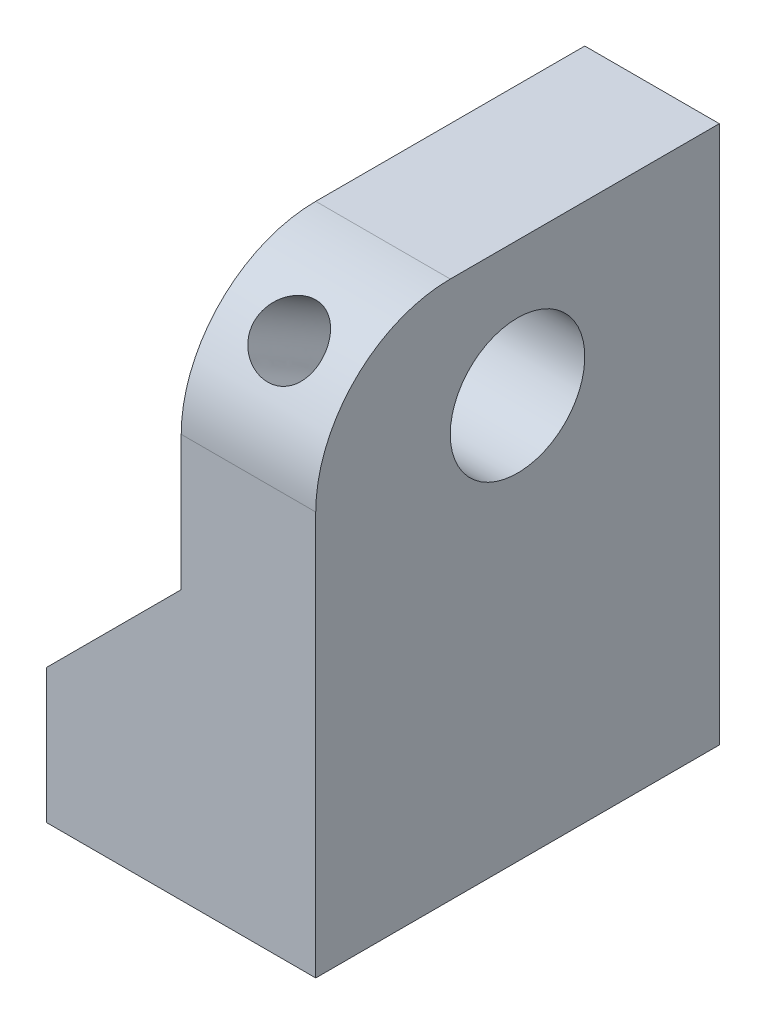
ISO-10303-21;
HEADER;
FILE_DESCRIPTION(('STEP AP214'),'2;1');
FILE_NAME('part.step','',(''),(''),'','','');
FILE_SCHEMA(('AUTOMOTIVE_DESIGN { 1 0 10303 214 1 1 1 1 }'));
ENDSEC;
DATA;
#1=APPLICATION_CONTEXT('core data for automotive mechanical design processes');
#2=APPLICATION_PROTOCOL_DEFINITION('international standard','automotive_design',2000,#1);
#3=PRODUCT_CONTEXT('',#1,'mechanical');
#4=PRODUCT('Part','Part','',(#3));
#5=PRODUCT_RELATED_PRODUCT_CATEGORY('part','',(#4));
#6=PRODUCT_DEFINITION_FORMATION('','',#4);
#7=PRODUCT_DEFINITION_CONTEXT('part definition',#1,'design');
#8=PRODUCT_DEFINITION('design','',#6,#7);
#9=PRODUCT_DEFINITION_SHAPE('','',#8);
#10=(LENGTH_UNIT() NAMED_UNIT(*) SI_UNIT(.MILLI.,.METRE.));
#11=(NAMED_UNIT(*) PLANE_ANGLE_UNIT() SI_UNIT($,.RADIAN.));
#12=(NAMED_UNIT(*) SI_UNIT($,.STERADIAN.) SOLID_ANGLE_UNIT());
#13=UNCERTAINTY_MEASURE_WITH_UNIT(LENGTH_MEASURE(1.E-05),#10,'distance_accuracy_value','');
#14=(GEOMETRIC_REPRESENTATION_CONTEXT(3) GLOBAL_UNCERTAINTY_ASSIGNED_CONTEXT((#13)) GLOBAL_UNIT_ASSIGNED_CONTEXT((#10,
#11,#12)) REPRESENTATION_CONTEXT('',''));
#15=CARTESIAN_POINT('',(0.,0.,0.));
#16=DIRECTION('',(0.,0.,1.));
#17=DIRECTION('',(1.,0.,0.));
#18=AXIS2_PLACEMENT_3D('',#15,#16,#17);
#19=CARTESIAN_POINT('',(0.,76.2,50.8));
#20=DIRECTION('',(1.,0.,0.));
#21=DIRECTION('',(0.,0.,-1.));
#22=AXIS2_PLACEMENT_3D('',#19,#20,#21);
#23=CYLINDRICAL_SURFACE('',#22,25.4);
#24=CARTESIAN_POINT('',(50.8,76.2,50.8));
#25=DIRECTION('',(-1.,0.,0.));
#26=DIRECTION('',(0.,0.,1.));
#27=AXIS2_PLACEMENT_3D('',#24,#25,#26);
#28=CIRCLE('',#27,25.4);
#29=CARTESIAN_POINT('',(50.8,101.6,50.8));
#30=VERTEX_POINT('',#29);
#31=CARTESIAN_POINT('',(50.8,76.2,76.2));
#32=VERTEX_POINT('',#31);
#33=EDGE_CURVE('E11',#30,#32,#28,.F.);
#34=ORIENTED_EDGE('',*,*,#33,.F.);
#35=DIRECTION('',(-1.,0.,0.));
#36=VECTOR('',#35,1.);
#37=CARTESIAN_POINT('',(50.8,101.6,50.8));
#38=LINE('',#37,#36);
#39=CARTESIAN_POINT('',(25.4,101.6,50.8));
#40=VERTEX_POINT('',#39);
#41=EDGE_CURVE('E52',#40,#30,#38,.F.);
#42=ORIENTED_EDGE('',*,*,#41,.F.);
#43=CARTESIAN_POINT('',(25.4,76.2,50.8));
#44=DIRECTION('',(1.,0.,0.));
#45=DIRECTION('',(0.,1.,0.));
#46=AXIS2_PLACEMENT_3D('',#43,#44,#45);
#47=CIRCLE('',#46,25.4);
#48=CARTESIAN_POINT('',(25.4,76.2,76.2));
#49=VERTEX_POINT('',#48);
#50=EDGE_CURVE('E67',#49,#40,#47,.F.);
#51=ORIENTED_EDGE('',*,*,#50,.F.);
#52=DIRECTION('',(-1.,0.,0.));
#53=VECTOR('',#52,1.);
#54=CARTESIAN_POINT('',(25.4,76.2,76.2));
#55=LINE('',#54,#53);
#56=EDGE_CURVE('E128',#32,#49,#55,.T.);
#57=ORIENTED_EDGE('',*,*,#56,.F.);
#58=EDGE_LOOP('',(#34,#42,#51,#57));
#59=FACE_BOUND('',#58,.T.);
#60=CARTESIAN_POINT('',(38.1,89.275241336489,72.5760892722401));
#61=CARTESIAN_POINT('',(37.9170328962884,89.2752373420838,72.576089398587));
#62=CARTESIAN_POINT('',(37.7341180644595,89.2818028812081,72.5721528815052));
#63=CARTESIAN_POINT('',(37.3695154465627,89.3079997814108,72.5563921952738));
#64=CARTESIAN_POINT('',(37.1878278252673,89.3276328631241,72.5445669874007));
#65=CARTESIAN_POINT('',(36.8269479681974,89.379808979736,72.5129813060565));
#66=CARTESIAN_POINT('',(36.647756723884,89.4123570006839,72.4932177678111));
#67=CARTESIAN_POINT('',(36.2931450450948,89.4900878066098,72.4456841476632));
#68=CARTESIAN_POINT('',(36.117725987809,89.535275124486,72.4179111931901));
#69=CARTESIAN_POINT('',(35.7719648604664,89.6378869233838,72.3542765433301));
#70=CARTESIAN_POINT('',(35.6016238698121,89.6953139852611,72.3184131419091));
#71=CARTESIAN_POINT('',(35.2672463507092,89.8219082300627,72.2384985176156));
#72=CARTESIAN_POINT('',(35.1032127801747,89.8910808407511,72.1944435084005));
#73=CARTESIAN_POINT('',(34.782815108772,90.0404970529847,72.09808767309));
#74=CARTESIAN_POINT('',(34.6264498677734,90.1207390019305,72.0457880777061));
#75=CARTESIAN_POINT('',(34.3226765242754,90.2915013443349,71.9329140118233));
#76=CARTESIAN_POINT('',(34.1752639338568,90.3820165214866,71.8723437376773));
#77=CARTESIAN_POINT('',(33.893208161926,90.5706815113395,71.7441225579569));
#78=CARTESIAN_POINT('',(33.7583764517028,90.6686549357898,71.6766269098176));
#79=CARTESIAN_POINT('',(33.4995646782023,90.8727048917007,71.5337221323937));
#80=CARTESIAN_POINT('',(33.3755801871744,90.9787780834729,71.4583162599029));
#81=CARTESIAN_POINT('',(33.13944193449,91.1980191010517,71.2997005707466));
#82=CARTESIAN_POINT('',(33.0272878181255,91.3111867139852,71.2164909881998));
#83=CARTESIAN_POINT('',(32.8157611854779,91.5434845043886,71.0424932709063));
#84=CARTESIAN_POINT('',(32.7163882011309,91.6626144632865,70.9517054138883));
#85=CARTESIAN_POINT('',(32.5350900923264,91.9006039397561,70.7667923055924));
#86=CARTESIAN_POINT('',(32.4526138253318,92.0192713807174,70.672959797923));
#87=CARTESIAN_POINT('',(32.3008055840992,92.2598598709922,70.4790438256468));
#88=CARTESIAN_POINT('',(32.2314732128993,92.3817808219187,70.3789605499424));
#89=CARTESIAN_POINT('',(32.1064544329348,92.6277203646467,70.1730667704056));
#90=CARTESIAN_POINT('',(32.0507655693029,92.7517385747903,70.0672573010727));
#91=CARTESIAN_POINT('',(31.95336115107,93.0007652716906,69.8504995118036));
#92=CARTESIAN_POINT('',(31.9116454631014,93.1257737489839,69.7395512409265));
#93=CARTESIAN_POINT('',(31.8432750069799,93.3724406719273,69.516149420471));
#94=CARTESIAN_POINT('',(31.816257546296,93.4941018812851,69.4038096193095));
#95=CARTESIAN_POINT('',(31.7756862792739,93.7364104102162,69.1755821214147));
#96=CARTESIAN_POINT('',(31.7621369672731,93.857057378028,69.0596932536429));
#97=CARTESIAN_POINT('',(31.7484274830974,94.096377536044,68.8251970701919));
#98=CARTESIAN_POINT('',(31.7482633309028,94.2150513024775,68.7065905730809));
#99=CARTESIAN_POINT('',(31.7611104228372,94.449714035476,68.4673717447368));
#100=CARTESIAN_POINT('',(31.7741266677762,94.5657019659155,68.3467586692663));
#101=CARTESIAN_POINT('',(31.8135182973102,94.7970380797285,68.1014244207645));
#102=CARTESIAN_POINT('',(31.8402113467269,94.9123018702135,67.9766747418967));
#103=CARTESIAN_POINT('',(31.906728731689,95.1386346097535,67.7267998932782));
#104=CARTESIAN_POINT('',(31.9465578254243,95.2497020225078,67.6016746037699));
#105=CARTESIAN_POINT('',(32.0388910578041,95.4670591318318,67.3519730924709));
#106=CARTESIAN_POINT('',(32.0913937828693,95.5733493596673,67.2273968110222));
#107=CARTESIAN_POINT('',(32.2085855979662,95.7807414163314,66.9796394213705));
#108=CARTESIAN_POINT('',(32.2732790689106,95.88184136329,66.8564588316513));
#109=CARTESIAN_POINT('',(32.4942088214073,96.1897375097833,66.474233945182));
#110=CARTESIAN_POINT('',(32.6712498031777,96.386805024718,66.2190352837175));
#111=CARTESIAN_POINT('',(33.0736572245433,96.7531133603295,65.727283276996));
#112=CARTESIAN_POINT('',(33.2990452408207,96.922341696949,65.4907383213307));
#113=CARTESIAN_POINT('',(33.6755587933028,97.1578215473865,65.1509616520642));
#114=CARTESIAN_POINT('',(33.8112034744606,97.2348452165492,65.0377128352838));
#115=CARTESIAN_POINT('',(34.0936172942752,97.3805151114375,64.8200887848747));
#116=CARTESIAN_POINT('',(34.2403820823032,97.4491645863247,64.7157101144556));
#117=CARTESIAN_POINT('',(34.5442651418792,97.5779062245648,64.5171115673132));
#118=CARTESIAN_POINT('',(34.7013871836413,97.6379952463263,64.4228954231891));
#119=CARTESIAN_POINT('',(35.024915253335,97.7493470453009,64.2460610159931));
#120=CARTESIAN_POINT('',(35.1913165586874,97.8006142589626,64.1634369272106));
#121=CARTESIAN_POINT('',(35.5266678798114,97.8925712081376,64.0136227402381));
#122=CARTESIAN_POINT('',(35.695347521209,97.9335568390695,63.946009597093));
#123=CARTESIAN_POINT('',(36.0391572061371,98.0068862147522,63.8240079550915));
#124=CARTESIAN_POINT('',(36.2142838878502,98.0392343928715,63.7696126731631));
#125=CARTESIAN_POINT('',(36.5696201887176,98.0951150710156,63.675051707812));
#126=CARTESIAN_POINT('',(36.7498271112405,98.1186521567033,63.634878623153));
#127=CARTESIAN_POINT('',(37.113870409038,98.1567780997182,63.5695471626783));
#128=CARTESIAN_POINT('',(37.2977064074562,98.171367881173,63.5443872362272));
#129=CARTESIAN_POINT('',(37.6494110569053,98.1905222410386,63.5113041202144));
#130=CARTESIAN_POINT('',(37.8171011752571,98.1959211302291,63.5019471715164));
#131=CARTESIAN_POINT('',(38.1527744940046,98.1993064531977,63.4960832616476));
#132=CARTESIAN_POINT('',(38.3207576722889,98.1972934239235,63.4995753696418));
#133=CARTESIAN_POINT('',(38.6556902402708,98.185868838756,63.5193435171913));
#134=CARTESIAN_POINT('',(38.8226397653739,98.1764582735081,63.5356178450078));
#135=CARTESIAN_POINT('',(39.1542603606597,98.1502966244344,63.5806554749804));
#136=CARTESIAN_POINT('',(39.3189314293233,98.133545535715,63.6094187854624));
#137=CARTESIAN_POINT('',(39.6382675240259,98.0936153066236,63.6775424128112));
#138=CARTESIAN_POINT('',(39.7930691193214,98.0707205759204,63.716432021408));
#139=CARTESIAN_POINT('',(40.0985694250227,98.01835432824,63.8046932246532));
#140=CARTESIAN_POINT('',(40.249266693319,97.9888805322349,63.8540684512942));
#141=CARTESIAN_POINT('',(40.5456148172495,97.923490711384,63.962597026205));
#142=CARTESIAN_POINT('',(40.6912666823686,97.8875759842274,64.0217484046327));
#143=CARTESIAN_POINT('',(40.9768573873873,97.8094165039998,64.1491085908576));
#144=CARTESIAN_POINT('',(41.1167940222591,97.7671693365866,64.2173208521246));
#145=CARTESIAN_POINT('',(41.398923304933,97.6736053563546,64.3665955212841));
#146=CARTESIAN_POINT('',(41.5406954131023,97.6218830828068,64.4481987395441));
#147=CARTESIAN_POINT('',(41.816320125589,97.511574966016,64.6198110753366));
#148=CARTESIAN_POINT('',(41.9501699617036,97.4529867447328,64.7098231030814));
#149=CARTESIAN_POINT('',(42.2093103940579,97.329098537622,64.8972982612875));
#150=CARTESIAN_POINT('',(42.3345992687859,97.2637972084382,64.9947628820795));
#151=CARTESIAN_POINT('',(42.5760294274726,97.1266414763888,65.1961982605011));
#152=CARTESIAN_POINT('',(42.692170178689,97.0547866924068,65.3001693964069));
#153=CARTESIAN_POINT('',(42.9250410512249,96.8977542790197,65.5235620977751));
#154=CARTESIAN_POINT('',(43.0408377567701,96.8119591077095,65.643524268294));
#155=CARTESIAN_POINT('',(43.2601767969319,96.6329907541275,65.8889345488815));
#156=CARTESIAN_POINT('',(43.3637225267506,96.5398196280118,66.0143811257554));
#157=CARTESIAN_POINT('',(43.5580004277181,96.3462805508214,66.2697465677942));
#158=CARTESIAN_POINT('',(43.6487245388916,96.2459081320796,66.399668182822));
#159=CARTESIAN_POINT('',(43.8165846615126,96.0383876568847,66.6627371515501));
#160=CARTESIAN_POINT('',(43.8937259663262,95.9312422621553,66.7958832255297));
#161=CARTESIAN_POINT('',(44.0357060696701,95.7075541275118,67.0679801465247));
#162=CARTESIAN_POINT('',(44.1001543745026,95.5908353119216,67.2069904810975));
#163=CARTESIAN_POINT('',(44.2133420947871,95.351259919494,67.4860132384536));
#164=CARTESIAN_POINT('',(44.2620881081716,95.2284059457133,67.6260252150114));
#165=CARTESIAN_POINT('',(44.3432509593557,94.9772333740693,67.9058718086362));
#166=CARTESIAN_POINT('',(44.3756691660085,94.8489152352766,68.0457064395902));
#167=CARTESIAN_POINT('',(44.4236038815587,94.5876809636561,68.323972046105));
#168=CARTESIAN_POINT('',(44.4391215488139,94.454765146596,68.4624031172209));
#169=CARTESIAN_POINT('',(44.4524300935146,94.1927406930912,68.7291468593106));
#170=CARTESIAN_POINT('',(44.4511430821806,94.063820754714,68.8575991571289));
#171=CARTESIAN_POINT('',(44.4328100163536,93.8038213703786,69.1111561430837));
#172=CARTESIAN_POINT('',(44.4157644622504,93.6727419931202,69.2362609373856));
#173=CARTESIAN_POINT('',(44.3658305337427,93.4096110549471,69.4821224736857));
#174=CARTESIAN_POINT('',(44.3329477574145,93.2775598537778,69.6028807358807));
#175=CARTESIAN_POINT('',(44.2514291443353,93.0136802474281,69.8392101736196));
#176=CARTESIAN_POINT('',(44.2027940423376,92.8818518321443,69.9547815908131));
#177=CARTESIAN_POINT('',(44.0936498820483,92.6280843105924,70.1727702157209));
#178=CARTESIAN_POINT('',(44.0340952996417,92.5060504643264,70.2755563274971));
#179=CARTESIAN_POINT('',(43.9018060405661,92.2644141554965,70.4753443045257));
#180=CARTESIAN_POINT('',(43.8290714625919,92.1448116747333,70.5723462130844));
#181=CARTESIAN_POINT('',(43.6709495779706,91.9091455848316,70.7600963220617));
#182=CARTESIAN_POINT('',(43.5855636777756,91.7930815840462,70.8508452159894));
#183=CARTESIAN_POINT('',(43.4027719506666,91.5655397125443,71.0257455957321));
#184=CARTESIAN_POINT('',(43.305366023084,91.4540618802477,71.1098970262833));
#185=CARTESIAN_POINT('',(43.1005184918734,91.2380145774993,71.2703691130382));
#186=CARTESIAN_POINT('',(42.9932115381826,91.1333781927136,71.3467717124511));
#187=CARTESIAN_POINT('',(42.7683507167729,90.930452245046,71.4927380296141));
#188=CARTESIAN_POINT('',(42.6507934009314,90.8321648374041,71.5622994291763));
#189=CARTESIAN_POINT('',(42.4063389843918,90.6428309007877,71.6944481973872));
#190=CARTESIAN_POINT('',(42.2794432270873,90.5517833342217,71.7570365659066));
#191=CARTESIAN_POINT('',(42.0171526810877,90.3776426966344,71.8752349686635));
#192=CARTESIAN_POINT('',(41.8817547635049,90.2945525827853,71.9308424109967));
#193=CARTESIAN_POINT('',(41.5988537013059,90.1344503436595,72.0367749976392));
#194=CARTESIAN_POINT('',(41.4510988739828,90.0577280379905,72.0868662291808));
#195=CARTESIAN_POINT('',(41.1486131325098,89.9141848890179,72.1796266844668));
#196=CARTESIAN_POINT('',(40.9938818958314,89.8473645041064,72.2222955646224));
#197=CARTESIAN_POINT('',(40.6785628221799,89.7242051252532,72.3002603223676));
#198=CARTESIAN_POINT('',(40.5179770041948,89.6678625581096,72.3355587139872));
#199=CARTESIAN_POINT('',(40.1920280650791,89.5660996583114,72.3988645668754));
#200=CARTESIAN_POINT('',(40.0266653821351,89.520678327382,72.4268726945428));
#201=CARTESIAN_POINT('',(39.5735390249837,89.4129045077977,72.4929864582326));
#202=CARTESIAN_POINT('',(39.2820924589765,89.3613695641624,72.5241787518754));
#203=CARTESIAN_POINT('',(38.6937183324265,89.2925400439021,72.5657307708515));
#204=CARTESIAN_POINT('',(38.3967903973555,89.2752478158018,72.5760890672931));
#205=CARTESIAN_POINT('',(38.1,89.275241336489,72.5760892722401));
#206=B_SPLINE_CURVE_WITH_KNOTS('',3,(#60,#61,#62,#63,#64,#65,#66,#67,#68,#69,#70,#71,#72,#73,
#74,#75,#76,#77,#78,#79,#80,#81,#82,#83,#84,#85,#86,#87,#88,#89,#90,#91,#92,#93,#94,#95,#96,#97,
#98,#99,#100,#101,#102,#103,#104,#105,#106,#107,#108,#109,#110,#111,#112,#113,#114,#115,#116,
#117,#118,#119,#120,#121,#122,#123,#124,#125,#126,#127,#128,#129,#130,#131,#132,#133,#134,#135,
#136,#137,#138,#139,#140,#141,#142,#143,#144,#145,#146,#147,#148,#149,#150,#151,#152,#153,#154,
#155,#156,#157,#158,#159,#160,#161,#162,#163,#164,#165,#166,#167,#168,#169,#170,#171,#172,#173,
#174,#175,#176,#177,#178,#179,#180,#181,#182,#183,#184,#185,#186,#187,#188,#189,#190,#191,#192,
#193,#194,#195,#196,#197,#198,#199,#200,#201,#202,#203,#204,#205),.UNSPECIFIED.,.T.,.F.,(4,2,2,
2,2,2,2,2,2,2,2,2,2,2,2,2,2,2,2,2,2,2,2,2,2,2,2,2,2,2,2,2,2,2,2,2,2,2,2,2,2,2,2,2,2,2,2,2,2,2,2,
2,2,2,2,2,2,2,2,2,2,2,2,2,2,2,2,2,2,2,2,2,4),(0.,0.548650903349508,1.09737406318471,
1.64630927410327,2.1954416055535,2.74468984105992,3.29419258521964,3.84361337984142,
4.39275643965139,4.93153258284043,5.47008776558209,6.00862679632837,6.54714609935777,
7.06342190724464,7.57968212047885,8.09584937501936,8.61201170283693,9.11478149499877,
9.61771900577285,10.1205069696989,10.6234857692672,11.138715557038,11.6541321787289,
12.1694913389197,12.6850360549493,13.783443955909,14.8823430863949,15.4600331720125,
16.0374983978673,16.6151750041281,17.1925602448859,17.7506770159904,18.3085067679373,
18.8660457968819,19.4235272303814,19.9269994813669,20.4304352596074,20.9338036314276,
21.4371723388241,21.920374818808,22.4037449435252,22.8870177902321,23.3704753631825,
23.8846180603086,24.3989393614494,24.9133637842161,25.4278181424457,25.9897165970377,
26.5514589620363,27.1135528957444,27.6754272881984,28.2525435559426,28.8294170084057,
29.4062420902262,29.9830276341482,30.5283030890678,31.0735612301421,31.6186267768981,
32.1636669032098,32.6739650916392,33.1842594589939,33.6944971392379,34.2047390930469,
34.7088500879047,35.2131313199106,35.7173401491569,36.2217356327354,36.7427220670374,
37.2637326119611,37.784565151916,38.305350066142,39.1952540408361,40.0852190471753),.UNSPECIFIED.);
#207=CARTESIAN_POINT('',(38.1,89.275241336489,72.5760892722401));
#208=VERTEX_POINT('',#207);
#209=EDGE_CURVE('E145',#208,#208,#206,.T.);
#210=ORIENTED_EDGE('',*,*,#209,.T.);
#211=EDGE_LOOP('',(#210));
#212=FACE_BOUND('',#211,.T.);
#213=ADVANCED_FACE('F39',(#59,#212),#23,.T.);
#214=CARTESIAN_POINT('',(0.,25.4,76.2));
#215=DIRECTION('',(1.,0.,0.));
#216=DIRECTION('',(0.,0.,-1.));
#217=AXIS2_PLACEMENT_3D('',#214,#215,#216);
#218=PLANE('',#217);
#219=DIRECTION('',(0.,-1.,0.));
#220=VECTOR('',#219,1.);
#221=CARTESIAN_POINT('',(0.,25.4,0.));
#222=LINE('',#221,#220);
#223=CARTESIAN_POINT('',(0.,25.4,0.));
#224=VERTEX_POINT('',#223);
#225=CARTESIAN_POINT('',(0.,0.,0.));
#226=VERTEX_POINT('',#225);
#227=EDGE_CURVE('E127',#224,#226,#222,.T.);
#228=ORIENTED_EDGE('',*,*,#227,.T.);
#229=DIRECTION('',(0.,0.,-1.));
#230=VECTOR('',#229,1.);
#231=CARTESIAN_POINT('',(0.,0.,76.2));
#232=LINE('',#231,#230);
#233=CARTESIAN_POINT('',(0.,0.,76.2));
#234=VERTEX_POINT('',#233);
#235=EDGE_CURVE('E106',#234,#226,#232,.T.);
#236=ORIENTED_EDGE('',*,*,#235,.F.);
#237=DIRECTION('',(0.,-1.,0.));
#238=VECTOR('',#237,1.);
#239=CARTESIAN_POINT('',(0.,25.4,76.2));
#240=LINE('',#239,#238);
#241=CARTESIAN_POINT('',(0.,25.4,76.2));
#242=VERTEX_POINT('',#241);
#243=EDGE_CURVE('E114',#242,#234,#240,.T.);
#244=ORIENTED_EDGE('',*,*,#243,.F.);
#245=DIRECTION('',(0.,0.,-1.));
#246=VECTOR('',#245,1.);
#247=CARTESIAN_POINT('',(0.,25.4,76.2));
#248=LINE('',#247,#246);
#249=EDGE_CURVE('E202',#242,#224,#248,.T.);
#250=ORIENTED_EDGE('',*,*,#249,.T.);
#251=EDGE_LOOP('',(#228,#236,#244,#250));
#252=FACE_BOUND('',#251,.T.);
#253=ADVANCED_FACE('F125',(#252),#218,.F.);
#254=CARTESIAN_POINT('',(0.,0.,76.2));
#255=DIRECTION('',(0.,1.,0.));
#256=DIRECTION('',(0.,0.,1.));
#257=AXIS2_PLACEMENT_3D('',#254,#255,#256);
#258=PLANE('',#257);
#259=DIRECTION('',(1.,0.,0.));
#260=VECTOR('',#259,1.);
#261=CARTESIAN_POINT('',(0.,0.,0.));
#262=LINE('',#261,#260);
#263=CARTESIAN_POINT('',(50.8,0.,0.));
#264=VERTEX_POINT('',#263);
#265=EDGE_CURVE('E204',#226,#264,#262,.T.);
#266=ORIENTED_EDGE('',*,*,#265,.T.);
#267=DIRECTION('',(0.,0.,-1.));
#268=VECTOR('',#267,1.);
#269=CARTESIAN_POINT('',(50.8,0.,76.2));
#270=LINE('',#269,#268);
#271=CARTESIAN_POINT('',(50.8,0.,76.2));
#272=VERTEX_POINT('',#271);
#273=EDGE_CURVE('E109',#272,#264,#270,.T.);
#274=ORIENTED_EDGE('',*,*,#273,.F.);
#275=DIRECTION('',(1.,0.,0.));
#276=VECTOR('',#275,1.);
#277=CARTESIAN_POINT('',(0.,0.,76.2));
#278=LINE('',#277,#276);
#279=EDGE_CURVE('E102',#234,#272,#278,.T.);
#280=ORIENTED_EDGE('',*,*,#279,.F.);
#281=ORIENTED_EDGE('',*,*,#235,.T.);
#282=EDGE_LOOP('',(#266,#274,#280,#281));
#283=FACE_BOUND('',#282,.T.);
#284=ADVANCED_FACE('F104',(#283),#258,.F.);
#285=CARTESIAN_POINT('',(50.8,0.,76.2));
#286=DIRECTION('',(-1.,0.,0.));
#287=DIRECTION('',(0.,0.,1.));
#288=AXIS2_PLACEMENT_3D('',#285,#286,#287);
#289=PLANE('',#288);
#290=CARTESIAN_POINT('',(50.8,76.2,38.1));
#291=DIRECTION('',(-1.,0.,0.));
#292=DIRECTION('',(0.,0.,1.));
#293=AXIS2_PLACEMENT_3D('',#290,#291,#292);
#294=CIRCLE('',#293,12.7);
#295=CARTESIAN_POINT('',(50.8,76.2,50.8));
#296=VERTEX_POINT('',#295);
#297=EDGE_CURVE('E139',#296,#296,#294,.T.);
#298=ORIENTED_EDGE('',*,*,#297,.T.);
#299=EDGE_LOOP('',(#298));
#300=FACE_BOUND('',#299,.T.);
#301=DIRECTION('',(0.,0.,-1.));
#302=VECTOR('',#301,1.);
#303=CARTESIAN_POINT('',(50.8,101.6,76.2));
#304=LINE('',#303,#302);
#305=CARTESIAN_POINT('',(50.8,101.6,0.));
#306=VERTEX_POINT('',#305);
#307=EDGE_CURVE('E132',#30,#306,#304,.T.);
#308=ORIENTED_EDGE('',*,*,#307,.F.);
#309=ORIENTED_EDGE('',*,*,#33,.T.);
#310=DIRECTION('',(0.,1.,0.));
#311=VECTOR('',#310,1.);
#312=CARTESIAN_POINT('',(50.8,0.,76.2));
#313=LINE('',#312,#311);
#314=EDGE_CURVE('E113',#272,#32,#313,.T.);
#315=ORIENTED_EDGE('',*,*,#314,.F.);
#316=ORIENTED_EDGE('',*,*,#273,.T.);
#317=DIRECTION('',(0.,1.,0.));
#318=VECTOR('',#317,1.);
#319=CARTESIAN_POINT('',(50.8,0.,0.));
#320=LINE('',#319,#318);
#321=EDGE_CURVE('E206',#264,#306,#320,.T.);
#322=ORIENTED_EDGE('',*,*,#321,.T.);
#323=EDGE_LOOP('',(#308,#309,#315,#316,#322));
#324=FACE_BOUND('',#323,.T.);
#325=ADVANCED_FACE('F181',(#300,#324),#289,.F.);
#326=CARTESIAN_POINT('',(50.8,101.6,76.2));
#327=DIRECTION('',(0.,-1.,0.));
#328=DIRECTION('',(0.,0.,-1.));
#329=AXIS2_PLACEMENT_3D('',#326,#327,#328);
#330=PLANE('',#329);
#331=DIRECTION('',(0.,0.,-1.));
#332=VECTOR('',#331,1.);
#333=CARTESIAN_POINT('',(25.4,101.6,76.2));
#334=LINE('',#333,#332);
#335=CARTESIAN_POINT('',(25.4,101.6,0.));
#336=VERTEX_POINT('',#335);
#337=EDGE_CURVE('E218',#40,#336,#334,.T.);
#338=ORIENTED_EDGE('',*,*,#337,.F.);
#339=ORIENTED_EDGE('',*,*,#41,.T.);
#340=ORIENTED_EDGE('',*,*,#307,.T.);
#341=DIRECTION('',(-1.,0.,0.));
#342=VECTOR('',#341,1.);
#343=CARTESIAN_POINT('',(50.8,101.6,0.));
#344=LINE('',#343,#342);
#345=EDGE_CURVE('E208',#306,#336,#344,.T.);
#346=ORIENTED_EDGE('',*,*,#345,.T.);
#347=EDGE_LOOP('',(#338,#339,#340,#346));
#348=FACE_BOUND('',#347,.T.);
#349=ADVANCED_FACE('F178',(#348),#330,.F.);
#350=CARTESIAN_POINT('',(25.4,101.6,76.2));
#351=DIRECTION('',(1.,0.,0.));
#352=DIRECTION('',(0.,1.,0.));
#353=AXIS2_PLACEMENT_3D('',#350,#351,#352);
#354=PLANE('',#353);
#355=CARTESIAN_POINT('',(25.4,76.2,38.1));
#356=DIRECTION('',(1.,0.,0.));
#357=DIRECTION('',(0.,1.,0.));
#358=AXIS2_PLACEMENT_3D('',#355,#356,#357);
#359=CIRCLE('',#358,12.7);
#360=CARTESIAN_POINT('',(25.4,88.9,38.1));
#361=VERTEX_POINT('',#360);
#362=EDGE_CURVE('E137',#361,#361,#359,.T.);
#363=ORIENTED_EDGE('',*,*,#362,.T.);
#364=EDGE_LOOP('',(#363));
#365=FACE_BOUND('',#364,.T.);
#366=DIRECTION('',(0.,-1.,0.));
#367=VECTOR('',#366,1.);
#368=CARTESIAN_POINT('',(25.4,101.6,76.2));
#369=LINE('',#368,#367);
#370=CARTESIAN_POINT('',(25.4,50.8,76.2));
#371=VERTEX_POINT('',#370);
#372=EDGE_CURVE('E197',#49,#371,#369,.T.);
#373=ORIENTED_EDGE('',*,*,#372,.F.);
#374=ORIENTED_EDGE('',*,*,#50,.T.);
#375=ORIENTED_EDGE('',*,*,#337,.T.);
#376=DIRECTION('',(0.,-1.,0.));
#377=VECTOR('',#376,1.);
#378=CARTESIAN_POINT('',(25.4,101.6,0.));
#379=LINE('',#378,#377);
#380=CARTESIAN_POINT('',(25.4,50.8,0.));
#381=VERTEX_POINT('',#380);
#382=EDGE_CURVE('E211',#336,#381,#379,.T.);
#383=ORIENTED_EDGE('',*,*,#382,.T.);
#384=DIRECTION('',(0.,0.,-1.));
#385=VECTOR('',#384,1.);
#386=CARTESIAN_POINT('',(25.4,50.8,76.2));
#387=LINE('',#386,#385);
#388=EDGE_CURVE('E215',#371,#381,#387,.T.);
#389=ORIENTED_EDGE('',*,*,#388,.F.);
#390=EDGE_LOOP('',(#373,#374,#375,#383,#389));
#391=FACE_BOUND('',#390,.T.);
#392=ADVANCED_FACE('F174',(#365,#391),#354,.F.);
#393=CARTESIAN_POINT('',(25.4,50.8,76.2));
#394=DIRECTION('',(0.707106781186547,-0.707106781186547,0.));
#395=DIRECTION('',(0.707106781186548,0.707106781186548,0.));
#396=AXIS2_PLACEMENT_3D('',#393,#394,#395);
#397=PLANE('',#396);
#398=DIRECTION('',(-0.707106781186547,-0.707106781186547,0.));
#399=VECTOR('',#398,1.);
#400=CARTESIAN_POINT('',(25.4,50.8,0.));
#401=LINE('',#400,#399);
#402=EDGE_CURVE('E123',#381,#224,#401,.T.);
#403=ORIENTED_EDGE('',*,*,#402,.T.);
#404=ORIENTED_EDGE('',*,*,#249,.F.);
#405=DIRECTION('',(-0.707106781186547,-0.707106781186547,0.));
#406=VECTOR('',#405,1.);
#407=CARTESIAN_POINT('',(25.4,50.8,76.2));
#408=LINE('',#407,#406);
#409=EDGE_CURVE('E119',#371,#242,#408,.T.);
#410=ORIENTED_EDGE('',*,*,#409,.F.);
#411=ORIENTED_EDGE('',*,*,#388,.T.);
#412=EDGE_LOOP('',(#403,#404,#410,#411));
#413=FACE_BOUND('',#412,.T.);
#414=ADVANCED_FACE('F168',(#413),#397,.F.);
#415=CARTESIAN_POINT('',(0.,0.,76.2));
#416=DIRECTION('',(0.,0.,1.));
#417=DIRECTION('',(1.,0.,0.));
#418=AXIS2_PLACEMENT_3D('',#415,#416,#417);
#419=PLANE('',#418);
#420=ORIENTED_EDGE('',*,*,#314,.T.);
#421=ORIENTED_EDGE('',*,*,#56,.T.);
#422=ORIENTED_EDGE('',*,*,#372,.T.);
#423=ORIENTED_EDGE('',*,*,#409,.T.);
#424=ORIENTED_EDGE('',*,*,#243,.T.);
#425=ORIENTED_EDGE('',*,*,#279,.T.);
#426=EDGE_LOOP('',(#420,#421,#422,#423,#424,#425));
#427=FACE_BOUND('',#426,.T.);
#428=ADVANCED_FACE('F117',(#427),#419,.T.);
#429=CARTESIAN_POINT('',(0.,0.,0.));
#430=DIRECTION('',(0.,0.,1.));
#431=DIRECTION('',(1.,0.,0.));
#432=AXIS2_PLACEMENT_3D('',#429,#430,#431);
#433=PLANE('',#432);
#434=ORIENTED_EDGE('',*,*,#227,.F.);
#435=ORIENTED_EDGE('',*,*,#402,.F.);
#436=ORIENTED_EDGE('',*,*,#382,.F.);
#437=ORIENTED_EDGE('',*,*,#345,.F.);
#438=ORIENTED_EDGE('',*,*,#321,.F.);
#439=ORIENTED_EDGE('',*,*,#265,.F.);
#440=EDGE_LOOP('',(#434,#435,#436,#437,#438,#439));
#441=FACE_BOUND('',#440,.T.);
#442=ADVANCED_FACE('F165',(#441),#433,.F.);
#443=CARTESIAN_POINT('',(-252.476,76.2,38.1));
#444=DIRECTION('',(1.,0.,0.));
#445=DIRECTION('',(0.,0.,-1.));
#446=AXIS2_PLACEMENT_3D('',#443,#444,#445);
#447=CYLINDRICAL_SURFACE('',#446,12.7);
#448=CARTESIAN_POINT('',(38.1,76.5167887801176,50.7960483958117));
#449=CARTESIAN_POINT('',(38.26955887704,76.5167903777425,50.7960490730338));
#450=CARTESIAN_POINT('',(38.4391435959277,76.524307692445,50.7958676590341));
#451=CARTESIAN_POINT('',(38.7770579388246,76.5542507984094,50.795066911847));
#452=CARTESIAN_POINT('',(38.9453868910705,76.5766840610596,50.7944473591864));
#453=CARTESIAN_POINT('',(39.2797395337163,76.6361195255683,50.7925443949588));
#454=CARTESIAN_POINT('',(39.4457588334382,76.6731463555423,50.7912598600126));
#455=CARTESIAN_POINT('',(39.7741007307913,76.7611730323462,50.787672020779));
#456=CARTESIAN_POINT('',(39.9364217424337,76.8121787561686,50.7853682877506));
#457=CARTESIAN_POINT('',(40.2554894423056,76.9271115180055,50.7792981140816));
#458=CARTESIAN_POINT('',(40.4122596122152,76.9909737983789,50.7755389202068));
#459=CARTESIAN_POINT('',(40.7202049970693,77.1309327345313,50.7660284719049));
#460=CARTESIAN_POINT('',(40.8713780587552,77.2070340398292,50.7602764594579));
#461=CARTESIAN_POINT('',(41.3151428076919,77.4522917124247,50.739174340256));
#462=CARTESIAN_POINT('',(41.5982986034049,77.6385188340318,50.7199743945658));
#463=CARTESIAN_POINT('',(42.1526115707416,78.0638297439255,50.6644390865775));
#464=CARTESIAN_POINT('',(42.4215124046588,78.3057159082762,50.6269902505374));
#465=CARTESIAN_POINT('',(42.7935769986159,78.6948470383687,50.5532430911068));
#466=CARTESIAN_POINT('',(42.9124598029723,78.8290492078173,50.5257050487529));
#467=CARTESIAN_POINT('',(43.1389920450781,79.1051690551609,50.4640595375469));
#468=CARTESIAN_POINT('',(43.2466462200262,79.2470834406319,50.4299548564904));
#469=CARTESIAN_POINT('',(43.4528173554866,79.5416852279524,50.3534471413012));
#470=CARTESIAN_POINT('',(43.5509810510462,79.6945653217655,50.3108330637835));
#471=CARTESIAN_POINT('',(43.7335196241442,80.005867662273,50.2174155016588));
#472=CARTESIAN_POINT('',(43.8179012141807,80.1642871651079,50.1666160277978));
#473=CARTESIAN_POINT('',(43.9719086154955,80.485169137989,50.0564243858199));
#474=CARTESIAN_POINT('',(44.0415417437002,80.6476295583621,49.9970365032632));
#475=CARTESIAN_POINT('',(44.1651583901166,80.975026568653,49.8694506456172));
#476=CARTESIAN_POINT('',(44.2191440635236,81.1399628142695,49.801253885687));
#477=CARTESIAN_POINT('',(44.3061594171568,81.4543247756606,49.6632429283427));
#478=CARTESIAN_POINT('',(44.3407256035298,81.6036843689797,49.5942440773104));
#479=CARTESIAN_POINT('',(44.3960014012081,81.9016442226092,49.449391291742));
#480=CARTESIAN_POINT('',(44.4167119357379,82.0502445328569,49.3735378143231));
#481=CARTESIAN_POINT('',(44.4439722899477,82.3452569820154,49.2154760856171));
#482=CARTESIAN_POINT('',(44.4505290311029,82.4916701556741,49.1332709607882));
#483=CARTESIAN_POINT('',(44.4494043587261,82.7810699382796,48.9631342801222));
#484=CARTESIAN_POINT('',(44.4417237169735,82.9240567325378,48.8752030349358));
#485=CARTESIAN_POINT('',(44.413571735953,83.1927183919565,48.7025962975619));
#486=CARTESIAN_POINT('',(44.3943145923152,83.3187926499704,48.6183407580097));
#487=CARTESIAN_POINT('',(44.3443326282958,83.5663570414667,48.446472646811));
#488=CARTESIAN_POINT('',(44.3136039595224,83.6878456214988,48.3588589574554));
#489=CARTESIAN_POINT('',(44.2410381064517,83.9254781859366,48.1811208540011));
#490=CARTESIAN_POINT('',(44.1992045841642,84.041623917448,48.0909972763333));
#491=CARTESIAN_POINT('',(44.1048462575466,84.2681219576204,47.9090023751409));
#492=CARTESIAN_POINT('',(44.0523173524573,84.3784720236665,47.8171303935388));
#493=CARTESIAN_POINT('',(43.9356620366374,84.5955595183787,47.6302457930657));
#494=CARTESIAN_POINT('',(43.871283514986,84.7021426965896,47.5352113000016));
#495=CARTESIAN_POINT('',(43.7324059201973,84.9084890500232,47.3451033361938));
#496=CARTESIAN_POINT('',(43.6579031853535,85.0082497379851,47.2500298638133));
#497=CARTESIAN_POINT('',(43.4200779006346,85.2969741483084,46.9661017089819));
#498=CARTESIAN_POINT('',(43.2423724195339,85.4755009640874,46.7784338229587));
#499=CARTESIAN_POINT('',(42.8325674768401,85.8215788863778,46.3939288650745));
#500=CARTESIAN_POINT('',(42.5966815621718,85.9859090905021,46.1982609058036));
#501=CARTESIAN_POINT('',(42.0889605126648,86.2805314770051,45.8284424532068));
#502=CARTESIAN_POINT('',(41.8171004097542,86.4107998299785,45.6543070685545));
#503=CARTESIAN_POINT('',(41.3753206232683,86.5857516395456,45.4100818519455));
#504=CARTESIAN_POINT('',(41.2159630170046,86.6422557503035,45.32895124684));
#505=CARTESIAN_POINT('',(40.8893610620171,86.7456980841634,45.1771940708658));
#506=CARTESIAN_POINT('',(40.7221198792642,86.7926401076822,45.1065633298921));
#507=CARTESIAN_POINT('',(40.3808278755966,86.8770501228206,44.9772501769649));
#508=CARTESIAN_POINT('',(40.2067791786351,86.9145210426349,44.9185640731664));
#509=CARTESIAN_POINT('',(39.8530331438125,86.9800710412175,44.8144515239043));
#510=CARTESIAN_POINT('',(39.6733363130619,87.0081509605247,44.7690238917912));
#511=CARTESIAN_POINT('',(39.3187611493854,87.0537836121146,44.6944822581826));
#512=CARTESIAN_POINT('',(39.1440884779238,87.0717909396766,44.6646685296773));
#513=CARTESIAN_POINT('',(38.7922823065562,87.0993617447236,44.6187909056863));
#514=CARTESIAN_POINT('',(38.6151488878071,87.1089255000146,44.6027265578262));
#515=CARTESIAN_POINT('',(38.2599916683594,87.1196073310883,44.5847733725166));
#516=CARTESIAN_POINT('',(38.0819683135371,87.1207292803997,44.5828780336098));
#517=CARTESIAN_POINT('',(37.7264914339795,87.1145373182523,44.5932975423403));
#518=CARTESIAN_POINT('',(37.5490378805501,87.1072238384854,44.605611662794));
#519=CARTESIAN_POINT('',(37.2111575073579,87.0851403019128,44.6424866932084));
#520=CARTESIAN_POINT('',(37.0505611484458,87.0710539893579,44.6659224443761));
#521=CARTESIAN_POINT('',(36.7321272141142,87.0358062430518,44.7239304304107));
#522=CARTESIAN_POINT('',(36.5742905965537,87.0146424021662,44.7585064540434));
#523=CARTESIAN_POINT('',(36.2624381640164,86.9652319381083,44.8380984688153));
#524=CARTESIAN_POINT('',(36.1084218142733,86.936986312473,44.8831129895257));
#525=CARTESIAN_POINT('',(35.8049907960477,86.8733709676053,44.9827789001575));
#526=CARTESIAN_POINT('',(35.6555779434486,86.8379984775788,45.0374340371414));
#527=CARTESIAN_POINT('',(35.3561919272064,86.7585002884324,45.1578668944509));
#528=CARTESIAN_POINT('',(35.206443696737,86.7140768079667,45.2240069044632));
#529=CARTESIAN_POINT('',(34.9135162039368,86.6173743265041,45.3646814793279));
#530=CARTESIAN_POINT('',(34.7703391787324,86.5650926757596,45.4392188736174));
#531=CARTESIAN_POINT('',(34.4912396442136,86.4525668000267,45.5956089898882));
#532=CARTESIAN_POINT('',(34.3553192094365,86.392320314957,45.6774637860941));
#533=CARTESIAN_POINT('',(34.0914061553697,86.2637586755419,45.8473939271653));
#534=CARTESIAN_POINT('',(33.9634140744326,86.1954429741926,45.9354696935809));
#535=CARTESIAN_POINT('',(33.7043816147276,86.0438324966694,46.125276390371));
#536=CARTESIAN_POINT('',(33.5741804978469,85.95973385187,46.2275133740179));
#537=CARTESIAN_POINT('',(33.3249026576364,85.7816474486021,46.4367196598546));
#538=CARTESIAN_POINT('',(33.205822241219,85.6876629953293,46.5436873734962));
#539=CARTESIAN_POINT('',(32.9795547457549,85.4896610872082,46.7610517446895));
#540=CARTESIAN_POINT('',(32.8723739617852,85.3856383758507,46.8714501779908));
#541=CARTESIAN_POINT('',(32.6709618292228,85.1676972092386,47.0941459884072));
#542=CARTESIAN_POINT('',(32.5767240340118,85.0537837268459,47.2064423886549));
#543=CARTESIAN_POINT('',(32.4035266871234,84.8181588456355,47.4296968491187));
#544=CARTESIAN_POINT('',(32.3243430740805,84.6966048789259,47.5406468760586));
#545=CARTESIAN_POINT('',(32.1803377862651,84.4445365796159,47.7615567319776));
#546=CARTESIAN_POINT('',(32.1155085367993,84.3140270206745,47.8715170536856));
#547=CARTESIAN_POINT('',(32.0010600461704,84.0447202666931,48.0890088764318));
#548=CARTESIAN_POINT('',(31.9514311431597,83.9059284034865,48.1965418799162));
#549=CARTESIAN_POINT('',(31.8680750678656,83.6209057557303,48.4078421667677));
#550=CARTESIAN_POINT('',(31.834345720865,83.4746759915587,48.5116099633411));
#551=CARTESIAN_POINT('',(31.7862237525139,83.1929285788336,48.7025727434095));
#552=CARTESIAN_POINT('',(31.770071482475,83.0580777965302,48.7903123128545));
#553=CARTESIAN_POINT('',(31.7509015416771,82.7844602169337,48.9609793365588));
#554=CARTESIAN_POINT('',(31.7478827647285,82.6456937504362,49.0439071955116));
#555=CARTESIAN_POINT('',(31.7550194124405,82.3653835899076,49.2042384933141));
#556=CARTESIAN_POINT('',(31.7651717636569,82.2238405513711,49.2816432165253));
#557=CARTESIAN_POINT('',(31.798506751263,81.93912714339,49.4304111324691));
#558=CARTESIAN_POINT('',(31.8216892207555,81.7959567948119,49.5017744025706));
#559=CARTESIAN_POINT('',(31.8790258217969,81.5176982571992,49.6340539153326));
#560=CARTESIAN_POINT('',(31.9124490662718,81.3826334414638,49.6953385366948));
#561=CARTESIAN_POINT('',(31.9902014727914,81.1130799059872,49.8120974443205));
#562=CARTESIAN_POINT('',(32.034534351563,80.9785913985044,49.8675697412219));
#563=CARTESIAN_POINT('',(32.1336385356706,80.7112269653887,49.9726348849214));
#564=CARTESIAN_POINT('',(32.1884071370534,80.5783506314983,50.0222292493369));
#565=CARTESIAN_POINT('',(32.3079081410964,80.3150236265424,50.1156610862857));
#566=CARTESIAN_POINT('',(32.372644349577,80.1845739034161,50.1594963479869));
#567=CARTESIAN_POINT('',(32.5156062508257,79.9194431984166,50.2439782389897));
#568=CARTESIAN_POINT('',(32.5943992520965,79.7849605925878,50.2842887154528));
#569=CARTESIAN_POINT('',(32.7619180124988,79.5205913548506,50.3589793214475));
#570=CARTESIAN_POINT('',(32.8506474353454,79.3907064415691,50.3933572516056));
#571=CARTESIAN_POINT('',(33.1308284046715,79.009246815223,50.4881658143262));
#572=CARTESIAN_POINT('',(33.3363410012895,78.7657409080941,50.5403102863493));
#573=CARTESIAN_POINT('',(33.8048219407548,78.2811852122559,50.631009093107));
#574=CARTESIAN_POINT('',(34.0716503796861,78.0434801209339,50.6673805533214));
#575=CARTESIAN_POINT('',(34.6402190481478,77.6108371078843,50.7232808019936));
#576=CARTESIAN_POINT('',(34.9419895156083,77.4159366570433,50.7427948770943));
#577=CARTESIAN_POINT('',(35.4228040975477,77.158503221,50.7640886542927));
#578=CARTESIAN_POINT('',(35.5918267374825,77.0771441952046,50.7698881596466));
#579=CARTESIAN_POINT('',(35.9364617918134,76.9297547919927,50.7792316603507));
#580=CARTESIAN_POINT('',(36.1120711323644,76.8637173652738,50.7827766942713));
#581=CARTESIAN_POINT('',(36.4682151628734,76.7482145851486,50.7882938574571));
#582=CARTESIAN_POINT('',(36.6487370774314,76.6987099996787,50.7902697259082));
#583=CARTESIAN_POINT('',(37.0135796756059,76.6170163624242,50.7932179232624));
#584=CARTESIAN_POINT('',(37.1978977468439,76.5848157905166,50.794190920223));
#585=CARTESIAN_POINT('',(37.5021396627171,76.5466952822916,50.7952750055674));
#586=CARTESIAN_POINT('',(37.6214244906635,76.5354905724283,50.7955701217854));
#587=CARTESIAN_POINT('',(37.8604685685162,76.5205366083525,50.7959565817861));
#588=CARTESIAN_POINT('',(37.9802278371599,76.5167876515952,50.7960479174388));
#589=CARTESIAN_POINT('',(38.1,76.5167887801176,50.7960483958117));
#590=B_SPLINE_CURVE_WITH_KNOTS('',3,(#448,#449,#450,#451,#452,#453,#454,#455,#456,#457,#458,
#459,#460,#461,#462,#463,#464,#465,#466,#467,#468,#469,#470,#471,#472,#473,#474,#475,#476,#477,
#478,#479,#480,#481,#482,#483,#484,#485,#486,#487,#488,#489,#490,#491,#492,#493,#494,#495,#496,
#497,#498,#499,#500,#501,#502,#503,#504,#505,#506,#507,#508,#509,#510,#511,#512,#513,#514,#515,
#516,#517,#518,#519,#520,#521,#522,#523,#524,#525,#526,#527,#528,#529,#530,#531,#532,#533,#534,
#535,#536,#537,#538,#539,#540,#541,#542,#543,#544,#545,#546,#547,#548,#549,#550,#551,#552,#553,
#554,#555,#556,#557,#558,#559,#560,#561,#562,#563,#564,#565,#566,#567,#568,#569,#570,#571,#572,
#573,#574,#575,#576,#577,#578,#579,#580,#581,#582,#583,#584,#585,#586,#587,#588,#589),
.UNSPECIFIED.,.T.,.F.,(4,2,2,2,2,2,2,2,2,2,2,2,2,2,2,2,2,2,2,2,2,2,2,2,2,2,2,2,2,2,2,2,2,2,2,2,
2,2,2,2,2,2,2,2,2,2,2,2,2,2,2,2,2,2,2,2,2,2,2,2,2,2,2,2,2,2,2,2,2,2,4),(0.,0.5085561512632,
1.0173672300589,1.52704068095749,2.03692873782706,2.54431004056664,3.0518845511617,
4.06602698937806,5.15172659934961,5.69537477134086,6.23879265023332,6.79789002280189,
7.35671427280925,7.91526062919944,8.47373001785873,8.97739953222429,9.48103548293322,
9.9844250901963,10.4877874105334,10.9458180128465,11.4040024105354,11.8620359016139,
12.3202453409606,12.7896556574975,13.259236203606,14.197882815054,15.2370132349685,
16.2768686890493,16.8388888381798,17.4006851767339,17.962307610866,18.5238797636794,
19.0574870261417,19.591076731486,20.1244215838785,20.6577391430117,21.145902822261,
21.6342326997371,22.1224938299018,22.6109451546147,23.1192864209043,23.6277994842428,
24.136457152919,24.6451493227878,25.2015340400846,25.7577333248931,26.3142254590685,
26.8704394036961,27.4175841428906,27.9644394660175,28.5109464647899,29.0573786914549,
29.5418170455011,30.0262145961601,30.5104991344022,30.9947774697943,31.4503823450343,
31.906142652516,32.3617850301807,32.8176018141008,33.300062096674,33.7827008593264,
34.747536514277,35.8206886256748,36.8947764553249,37.4571727456881,38.019309768183,
38.5801032133098,39.1405228469841,39.4997399004812,39.8589712850349),.UNSPECIFIED.);
#591=CARTESIAN_POINT('',(38.1,76.5167887801176,50.7960483958117));
#592=VERTEX_POINT('',#591);
#593=EDGE_CURVE('E42',#592,#592,#590,.T.);
#594=ORIENTED_EDGE('',*,*,#593,.T.);
#595=EDGE_LOOP('',(#594));
#596=FACE_BOUND('',#595,.T.);
#597=ORIENTED_EDGE('',*,*,#362,.F.);
#598=EDGE_LOOP('',(#597));
#599=FACE_BOUND('',#598,.T.);
#600=ORIENTED_EDGE('',*,*,#297,.F.);
#601=EDGE_LOOP('',(#600));
#602=FACE_BOUND('',#601,.T.);
#603=ADVANCED_FACE('F161',(#596,#599,#602),#447,.F.);
#604=CARTESIAN_POINT('',(38.1,71.7098719394654,42.5901280605346));
#605=CARTESIAN_POINT('',(38.1,90.1931156521865,74.1429987408444));
#606=CARTESIAN_POINT('',(50.8,71.7098719394654,42.5901280605346));
#607=CARTESIAN_POINT('',(50.8,90.1931156521865,74.1429987408444));
#608=CARTESIAN_POINT('',(50.8,80.6901280605346,33.6098719394654));
#609=CARTESIAN_POINT('',(50.8,99.1733717732557,65.1627426197752));
#610=CARTESIAN_POINT('',(38.1,80.6901280605346,33.6098719394654));
#611=CARTESIAN_POINT('',(38.1,99.1733717732557,65.1627426197752));
#612=CARTESIAN_POINT('',(25.4,80.6901280605346,33.6098719394654));
#613=CARTESIAN_POINT('',(25.4,99.1733717732557,65.1627426197752));
#614=CARTESIAN_POINT('',(25.4,71.7098719394654,42.5901280605346));
#615=CARTESIAN_POINT('',(25.4,90.1931156521865,74.1429987408444));
#616=CARTESIAN_POINT('',(38.1,71.7098719394654,42.5901280605346));
#617=CARTESIAN_POINT('',(38.1,90.1931156521865,74.1429987408444));
#618=(BOUNDED_SURFACE() B_SPLINE_SURFACE(3,1,((#604,#605),(#606,#607),(#608,#609),(#610,#611),
(#612,#613),(#614,#615),(#616,#617)),.UNSPECIFIED.,.T.,.F.,.F.) B_SPLINE_SURFACE_WITH_KNOTS((4,
3,4),(2,2),(0.,0.5,1.),(0.,1.),
.UNSPECIFIED.) GEOMETRIC_REPRESENTATION_ITEM() RATIONAL_B_SPLINE_SURFACE(((1.,1.),
(0.333333333333333,0.333333333333333),(0.333333333333333,0.333333333333333),(1.,1.),
(0.333333333333333,0.333333333333333),(0.333333333333333,0.333333333333333),(1.,1.))) REPRESENTATION_ITEM('') SURFACE());
#619=CARTESIAN_POINT('',(38.1,89.275241336489,72.5760892722401));
#620=CARTESIAN_POINT('',(38.1,89.1423407890268,72.349213846444));
#621=CARTESIAN_POINT('',(38.1,89.0094402415646,72.1223384206478));
#622=CARTESIAN_POINT('',(38.1,88.7436391466402,71.6685875690556));
#623=CARTESIAN_POINT('',(38.1,88.610738599178,71.4417121432595));
#624=CARTESIAN_POINT('',(38.1,88.3449375042536,70.9879612916672));
#625=CARTESIAN_POINT('',(38.1,88.2120369567914,70.7610858658711));
#626=CARTESIAN_POINT('',(38.1,87.946235861867,70.3073350142788));
#627=CARTESIAN_POINT('',(38.1,87.8133353144048,70.0804595884827));
#628=CARTESIAN_POINT('',(38.1,87.5475342194803,69.6267087368904));
#629=CARTESIAN_POINT('',(38.1,87.4146336720182,69.3998333110943));
#630=CARTESIAN_POINT('',(38.1,87.1488325770937,68.946082459502));
#631=CARTESIAN_POINT('',(38.1,87.0159320296315,68.7192070337059));
#632=CARTESIAN_POINT('',(38.1,86.7501309347071,68.2654561821136));
#633=CARTESIAN_POINT('',(38.1,86.6172303872449,68.0385807563175));
#634=CARTESIAN_POINT('',(38.1,86.3514292923205,67.5848299047252));
#635=CARTESIAN_POINT('',(38.1,86.2185287448583,67.3579544789291));
#636=CARTESIAN_POINT('',(38.1,85.9527276499339,66.9042036273368));
#637=CARTESIAN_POINT('',(38.1,85.8198271024717,66.6773282015407));
#638=CARTESIAN_POINT('',(38.1,85.5540260075473,66.2235773499485));
#639=CARTESIAN_POINT('',(38.1,85.4211254600851,65.9967019241523));
#640=CARTESIAN_POINT('',(38.1,85.1553243651607,65.5429510725601));
#641=CARTESIAN_POINT('',(38.1,85.0224238176985,65.3160756467639));
#642=CARTESIAN_POINT('',(38.1,84.7566227227741,64.8623247951717));
#643=CARTESIAN_POINT('',(38.1,84.6237221753119,64.6354493693756));
#644=CARTESIAN_POINT('',(38.1,84.3579210803875,64.1816985177833));
#645=CARTESIAN_POINT('',(38.1,84.2250205329253,63.9548230919872));
#646=CARTESIAN_POINT('',(38.1,83.9592194380009,63.5010722403949));
#647=CARTESIAN_POINT('',(38.1,83.8263188905387,63.2741968145988));
#648=CARTESIAN_POINT('',(38.1,83.5605177956143,62.8204459630065));
#649=CARTESIAN_POINT('',(38.1,83.4276172481521,62.5935705372104));
#650=CARTESIAN_POINT('',(38.1,83.1618161532277,62.1398196856181));
#651=CARTESIAN_POINT('',(38.1,83.0289156057655,61.912944259822));
#652=CARTESIAN_POINT('',(38.1,82.7631145108411,61.4591934082297));
#653=CARTESIAN_POINT('',(38.1,82.6302139633789,61.2323179824336));
#654=CARTESIAN_POINT('',(38.1,82.3644128684545,60.7785671308414));
#655=CARTESIAN_POINT('',(38.1,82.2315123209923,60.5516917050452));
#656=CARTESIAN_POINT('',(38.1,81.9657112260679,60.097940853453));
#657=CARTESIAN_POINT('',(38.1,81.8328106786057,59.8710654276568));
#658=CARTESIAN_POINT('',(38.1,81.5670095836813,59.4173145760646));
#659=CARTESIAN_POINT('',(38.1,81.4341090362191,59.1904391502684));
#660=CARTESIAN_POINT('',(38.1,81.1683079412946,58.7366882986762));
#661=CARTESIAN_POINT('',(38.1,81.0354073938324,58.5098128728801));
#662=CARTESIAN_POINT('',(38.1,80.769606298908,58.0560620212878));
#663=CARTESIAN_POINT('',(38.1,80.6367057514458,57.8291865954917));
#664=CARTESIAN_POINT('',(38.1,80.3709046565214,57.3754357438994));
#665=CARTESIAN_POINT('',(38.1,80.2380041090592,57.1485603181033));
#666=CARTESIAN_POINT('',(38.1,79.9722030141348,56.694809466511));
#667=CARTESIAN_POINT('',(38.1,79.8393024666726,56.4679340407149));
#668=CARTESIAN_POINT('',(38.1,79.5735013717482,56.0141831891226));
#669=CARTESIAN_POINT('',(38.1,79.440600824286,55.7873077633265));
#670=CARTESIAN_POINT('',(38.1,79.1747997293616,55.3335569117342));
#671=CARTESIAN_POINT('',(38.1,79.0418991818994,55.1066814859381));
#672=CARTESIAN_POINT('',(38.1,78.776098086975,54.6529306343459));
#673=CARTESIAN_POINT('',(38.1,78.6431975395128,54.4260552085497));
#674=CARTESIAN_POINT('',(38.1,78.3773964445884,53.9723043569575));
#675=CARTESIAN_POINT('',(38.1,78.2444958971262,53.7454289311613));
#676=CARTESIAN_POINT('',(38.1,77.9786948022018,53.2916780795691));
#677=CARTESIAN_POINT('',(38.1,77.8457942547396,53.0648026537729));
#678=CARTESIAN_POINT('',(38.1,77.5799931598152,52.6110518021807));
#679=CARTESIAN_POINT('',(38.1,77.447092612353,52.3841763763846));
#680=CARTESIAN_POINT('',(38.1,77.1812915174286,51.9304255247923));
#681=CARTESIAN_POINT('',(38.1,77.0483909699664,51.7035500989962));
#682=CARTESIAN_POINT('',(38.1,76.782589875042,51.2497992474039));
#683=CARTESIAN_POINT('',(38.1,76.6496893275798,51.0229238216078));
#684=CARTESIAN_POINT('',(38.1,76.5167887801176,50.7960483958117));
#685=B_SPLINE_CURVE_WITH_KNOTS('',3,(#619,#620,#621,#622,#623,#624,#625,#626,#627,#628,#629,
#630,#631,#632,#633,#634,#635,#636,#637,#638,#639,#640,#641,#642,#643,#644,#645,#646,#647,#648,
#649,#650,#651,#652,#653,#654,#655,#656,#657,#658,#659,#660,#661,#662,#663,#664,#665,#666,#667,
#668,#669,#670,#671,#672,#673,#674,#675,#676,#677,#678,#679,#680,#681,#682,#683,#684),
.UNSPECIFIED.,.F.,.F.,(4,2,2,2,2,2,2,2,2,2,2,2,2,2,2,2,2,2,2,2,2,2,2,2,2,2,2,2,2,2,2,2,4),(0.,
0.788806141655438,1.57761228331089,2.36641842496633,3.15522456662178,3.94403070827721,
4.73283684993267,5.52164299158813,6.31044913324357,7.09925527489901,7.88806141655446,
8.67686755820991,9.46567369986535,10.2544798415208,11.0432859831763,11.8320921248317,
12.6208982664871,13.4097044081426,14.198510549798,14.9873166914535,15.7761228331089,
16.5649289747644,17.3537351164198,18.1425412580753,18.9313473997307,19.7201535413862,
20.5089596830416,21.2977658246971,22.0865719663525,22.875378108008,23.6641842496634,
24.4529903913189,25.2417965329743),.UNSPECIFIED.);
#686=EDGE_CURVE('BSEAM156',#208,#592,#685,.T.);
#687=ORIENTED_EDGE('',*,*,#209,.F.);
#688=ORIENTED_EDGE('',*,*,#593,.F.);
#689=ORIENTED_EDGE('',*,*,#686,.T.);
#690=ORIENTED_EDGE('',*,*,#686,.F.);
#691=EDGE_LOOP('',(#687,#689,#688,#690));
#692=FACE_BOUND('',#691,.T.);
#693=ADVANCED_FACE('F156',(#692),#618,.F.);
#694=CLOSED_SHELL('',(#213,#253,#284,#325,#349,#392,#414,#428,#442,#603,#693));
#695=MANIFOLD_SOLID_BREP('B2',#694);
#696=ADVANCED_BREP_SHAPE_REPRESENTATION('',(#18,#695),#14);
#697=SHAPE_DEFINITION_REPRESENTATION(#9,#696);
ENDSEC;
END-ISO-10303-21;
